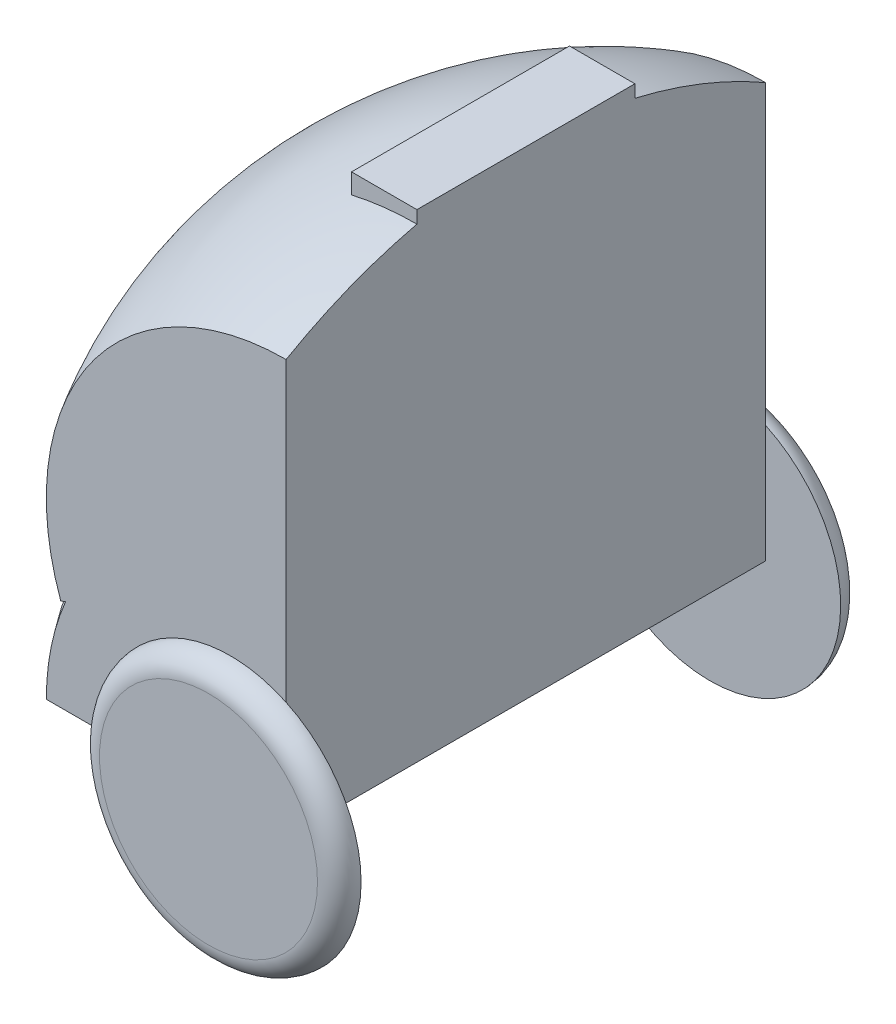
ISO-10303-21;
HEADER;
FILE_DESCRIPTION(('STEP AP214'),'2;1');
FILE_NAME('part.step','',(''),(''),'','','');
FILE_SCHEMA(('AUTOMOTIVE_DESIGN { 1 0 10303 214 1 1 1 1 }'));
ENDSEC;
DATA;
#1=APPLICATION_CONTEXT('core data for automotive mechanical design processes');
#2=APPLICATION_PROTOCOL_DEFINITION('international standard','automotive_design',2000,#1);
#3=PRODUCT_CONTEXT('',#1,'mechanical');
#4=PRODUCT('Part','Part','',(#3));
#5=PRODUCT_RELATED_PRODUCT_CATEGORY('part','',(#4));
#6=PRODUCT_DEFINITION_FORMATION('','',#4);
#7=PRODUCT_DEFINITION_CONTEXT('part definition',#1,'design');
#8=PRODUCT_DEFINITION('design','',#6,#7);
#9=PRODUCT_DEFINITION_SHAPE('','',#8);
#10=(LENGTH_UNIT() NAMED_UNIT(*) SI_UNIT(.MILLI.,.METRE.));
#11=(NAMED_UNIT(*) PLANE_ANGLE_UNIT() SI_UNIT($,.RADIAN.));
#12=(NAMED_UNIT(*) SI_UNIT($,.STERADIAN.) SOLID_ANGLE_UNIT());
#13=UNCERTAINTY_MEASURE_WITH_UNIT(LENGTH_MEASURE(1.E-05),#10,'distance_accuracy_value','');
#14=(GEOMETRIC_REPRESENTATION_CONTEXT(3) GLOBAL_UNCERTAINTY_ASSIGNED_CONTEXT((#13)) GLOBAL_UNIT_ASSIGNED_CONTEXT((#10,
#11,#12)) REPRESENTATION_CONTEXT('',''));
#15=CARTESIAN_POINT('',(0.,0.,0.));
#16=DIRECTION('',(0.,0.,1.));
#17=DIRECTION('',(1.,0.,0.));
#18=AXIS2_PLACEMENT_3D('',#15,#16,#17);
#19=CARTESIAN_POINT('',(-20.,0.,0.));
#20=DIRECTION('',(0.,0.,1.));
#21=DIRECTION('',(1.,0.,0.));
#22=AXIS2_PLACEMENT_3D('',#19,#20,#21);
#23=DEGENERATE_TOROIDAL_SURFACE('',#22,20.,93.0053761886914,.F.);
#24=CARTESIAN_POINT('',(-70.5858831778158,21.5882442492076,-55.0002));
#25=CARTESIAN_POINT('',(-71.9859669479254,21.0786554314085,-53.5169304533516));
#26=CARTESIAN_POINT('',(-73.3243789361277,20.5915133065178,-51.9683101868434));
#27=CARTESIAN_POINT('',(-75.8724012085119,19.6641090431226,-48.7545639388168));
#28=CARTESIAN_POINT('',(-77.0819754120248,19.2238600369076,-47.0894055363211));
#29=CARTESIAN_POINT('',(-79.348904355798,18.3987653781777,-43.6834225094398));
#30=CARTESIAN_POINT('',(-80.4082743165203,18.013186245399,-41.9441119666273));
#31=CARTESIAN_POINT('',(-82.3907924343558,17.2916086616134,-38.3807871618655));
#32=CARTESIAN_POINT('',(-83.3140239381899,16.955579874881,-36.5568256318827));
#33=CARTESIAN_POINT('',(-84.4113400530158,16.5561894715037,-34.1646883879962));
#34=CARTESIAN_POINT('',(-84.6498452047635,16.4693806955484,-33.629281085382));
#35=CARTESIAN_POINT('',(-85.1158210860264,16.2997793448828,-32.5516350266791));
#36=CARTESIAN_POINT('',(-85.3432665139075,16.2169959792141,-32.009383880414));
#37=CARTESIAN_POINT('',(-85.5648958667142,16.1363294917528,-31.4643944417996));
#38=B_SPLINE_CURVE_WITH_KNOTS('',3,(#24,#25,#26,#27,#28,#29,#30,#31,#32,#33,#34,#35,#36,#37),
.UNSPECIFIED.,.F.,.F.,(4,2,2,2,2,2,4),(0.,6.30456180395154,12.6108845666964,18.8223903207371,
25.0300773342398,26.8075422871663,28.5888987633277),.UNSPECIFIED.);
#39=CARTESIAN_POINT('',(-70.5860719669435,21.5881755355845,-55.));
#40=VERTEX_POINT('',#39);
#41=CARTESIAN_POINT('',(-73.2522754071277,20.6177568448593,-52.0089683465835));
#42=VERTEX_POINT('',#41);
#43=EDGE_CURVE('E207',#40,#42,#38,.T.);
#44=ORIENTED_EDGE('',*,*,#43,.F.);
#45=CARTESIAN_POINT('',(-20.,0.,-55.));
#46=DIRECTION('',(0.,0.,1.));
#47=DIRECTION('',(1.,0.,0.));
#48=AXIS2_PLACEMENT_3D('',#45,#46,#47);
#49=CIRCLE('',#48,55.);
#50=CARTESIAN_POINT('',(-75.,0.,-55.));
#51=VERTEX_POINT('',#50);
#52=EDGE_CURVE('E146',#40,#51,#49,.T.);
#53=ORIENTED_EDGE('',*,*,#52,.T.);
#54=CARTESIAN_POINT('',(0.,0.,0.));
#55=DIRECTION('',(0.,1.,0.));
#56=DIRECTION('',(0.,0.,1.));
#57=AXIS2_PLACEMENT_3D('',#54,#55,#56);
#58=CIRCLE('',#57,93.0053761886914);
#59=CARTESIAN_POINT('',(-75.,0.,55.));
#60=VERTEX_POINT('',#59);
#61=EDGE_CURVE('E286',#51,#60,#58,.T.);
#62=ORIENTED_EDGE('',*,*,#61,.T.);
#63=CARTESIAN_POINT('',(-20.,0.,55.));
#64=DIRECTION('',(0.,0.,1.));
#65=DIRECTION('',(1.,0.,0.));
#66=AXIS2_PLACEMENT_3D('',#63,#64,#65);
#67=CIRCLE('',#66,55.);
#68=CARTESIAN_POINT('',(-70.5860719669435,21.5881755355845,55.));
#69=VERTEX_POINT('',#68);
#70=EDGE_CURVE('E288',#69,#60,#67,.T.);
#71=ORIENTED_EDGE('',*,*,#70,.F.);
#72=CARTESIAN_POINT('',(-85.5648958667142,16.1363294917528,31.4643944417996));
#73=CARTESIAN_POINT('',(-85.1182419736263,16.2988982138559,32.5627269859426));
#74=CARTESIAN_POINT('',(-84.6479230618541,16.4700802983535,33.6500022293817));
#75=CARTESIAN_POINT('',(-83.6605599147931,16.8294510942951,35.8002908307443));
#76=CARTESIAN_POINT('',(-83.1435143222884,17.0176402997253,36.8633034828163));
#77=CARTESIAN_POINT('',(-81.5331062559626,17.6037809008901,39.9934461578371));
#78=CARTESIAN_POINT('',(-80.3722790336476,18.0262874569386,42.0218295238811));
#79=CARTESIAN_POINT('',(-77.8767200486395,18.9345966453372,45.9543177183319));
#80=CARTESIAN_POINT('',(-76.5419598349357,19.4204096330081,47.8584021379453));
#81=CARTESIAN_POINT('',(-74.4096929346977,20.1964913162059,50.6133966056721));
#82=CARTESIAN_POINT('',(-73.6736170348149,20.4644010339239,51.5187383688662));
#83=CARTESIAN_POINT('',(-72.1603409890285,21.0151884708182,53.2898303153666));
#84=CARTESIAN_POINT('',(-71.3831354734766,21.2980681443866,54.1555753015008));
#85=CARTESIAN_POINT('',(-70.5858831778158,21.5882442492076,55.0002));
#86=B_SPLINE_CURVE_WITH_KNOTS('',3,(#72,#73,#74,#75,#76,#77,#78,#79,#80,#81,#82,#83,#84,#85),
.UNSPECIFIED.,.F.,.F.,(4,2,2,2,2,2,4),(0.,3.58969941897906,7.17950313734413,14.2935043353267,
21.4086706670009,24.9989130657109,28.5896253479457),.UNSPECIFIED.);
#87=CARTESIAN_POINT('',(-73.2522754071276,20.6177568448593,52.0089683465836));
#88=VERTEX_POINT('',#87);
#89=EDGE_CURVE('E199',#88,#69,#86,.T.);
#90=ORIENTED_EDGE('',*,*,#89,.F.);
#91=CARTESIAN_POINT('',(-71.2346129573545,19.9999575437838,55.0002));
#92=CARTESIAN_POINT('',(-71.9688610285277,20.2212796989832,53.9577825618948));
#93=CARTESIAN_POINT('',(-72.6809406397668,20.4397704467221,52.8991670998298));
#94=CARTESIAN_POINT('',(-74.060053114577,20.8693274042112,50.7515528985336));
#95=CARTESIAN_POINT('',(-74.7270868871971,21.0803937637483,49.6625547730678));
#96=CARTESIAN_POINT('',(-76.0153536187748,21.4933255994882,47.4562723957654));
#97=CARTESIAN_POINT('',(-76.6365918259897,21.6951921289933,46.3389914049746));
#98=CARTESIAN_POINT('',(-77.8326958695606,22.0882278957065,44.0780335568028));
#99=CARTESIAN_POINT('',(-78.4075615174586,22.2793970894397,42.9343565921729));
#100=CARTESIAN_POINT('',(-79.5099070331423,22.6495362725192,40.6234561190515));
#101=CARTESIAN_POINT('',(-80.0374196401767,22.8285146694404,39.4562495730554));
#102=CARTESIAN_POINT('',(-81.0449691584019,23.1732207651699,37.0994715956909));
#103=CARTESIAN_POINT('',(-81.5250016657527,23.3389472345724,35.9098981019145));
#104=CARTESIAN_POINT('',(-82.4369530865813,23.6560443150717,33.5106815172943));
#105=CARTESIAN_POINT('',(-82.8688759717933,23.8074161110782,32.3010400926641));
#106=CARTESIAN_POINT('',(-83.6841927441509,24.0948914975889,29.8635970962876));
#107=CARTESIAN_POINT('',(-84.0675821181739,24.2309936680396,28.6357938475156));
#108=CARTESIAN_POINT('',(-84.7868620763784,24.4876412557893,26.1590238086939));
#109=CARTESIAN_POINT('',(-85.1225436779215,24.6081180366989,24.9099892111154));
#110=CARTESIAN_POINT('',(-85.7440891803539,24.8321352506472,22.3979596520562));
#111=CARTESIAN_POINT('',(-86.0299484665002,24.9356741147737,21.1349634089012));
#112=CARTESIAN_POINT('',(-86.5514430210002,25.12520113822,18.597448392701));
#113=CARTESIAN_POINT('',(-86.7870824421336,25.2111907486973,17.3229305814896));
#114=CARTESIAN_POINT('',(-87.2078967293744,25.3651543930577,14.7643966481112));
#115=CARTESIAN_POINT('',(-87.3930672263439,25.4331268671681,13.480379713474));
#116=CARTESIAN_POINT('',(-87.7126561269976,25.5506596607405,10.9054690615624));
#117=CARTESIAN_POINT('',(-87.8470847007801,25.6002236697411,9.61457677495558));
#118=CARTESIAN_POINT('',(-88.0650753842249,25.6806887457783,7.02792486181214));
#119=CARTESIAN_POINT('',(-88.1486374922056,25.711589812198,5.7321652351146));
#120=CARTESIAN_POINT('',(-88.2647931176471,25.7545628142702,3.13800768956397));
#121=CARTESIAN_POINT('',(-88.2973849078493,25.7666341118282,1.83960968279553));
#122=CARTESIAN_POINT('',(-88.311553252114,25.771880467467,-0.757390845087601));
#123=CARTESIAN_POINT('',(-88.2931341802576,25.7650571457244,-2.05599333911997));
#124=CARTESIAN_POINT('',(-88.2050149931057,25.732443993297,-4.66004382325121));
#125=CARTESIAN_POINT('',(-88.1349677741191,25.7065257853609,-5.96547847522404));
#126=CARTESIAN_POINT('',(-87.9432933183407,25.6357212265585,-8.57191819578897));
#127=CARTESIAN_POINT('',(-87.821670822857,25.590836619272,-9.87292366047624));
#128=CARTESIAN_POINT('',(-87.5269788189262,25.482338942635,-12.4684960255404));
#129=CARTESIAN_POINT('',(-87.3539020810989,25.4187232415563,-13.7630619951569));
#130=CARTESIAN_POINT('',(-86.9565433930753,25.2731269297976,-16.3431470714996));
#131=CARTESIAN_POINT('',(-86.7322662419803,25.1911480403438,-17.6286670144914));
#132=CARTESIAN_POINT('',(-86.2327682955909,25.0092825841188,-20.1885370565974));
#133=CARTESIAN_POINT('',(-85.9575459087543,24.9093954578928,-21.4628868054488));
#134=CARTESIAN_POINT('',(-85.3565305469213,24.6923023808316,-23.9979876600017));
#135=CARTESIAN_POINT('',(-85.0307421843537,24.5750980096541,-25.2587399947988));
#136=CARTESIAN_POINT('',(-84.3289996880626,24.3240652630733,-27.7644165809923));
#137=CARTESIAN_POINT('',(-83.9530502437914,24.1902384417481,-29.0093423000832));
#138=CARTESIAN_POINT('',(-83.1514571739509,23.9067846553467,-31.4811538600297));
#139=CARTESIAN_POINT('',(-82.7258157016414,23.7571583749211,-32.7080404799652));
#140=CARTESIAN_POINT('',(-81.5823222973909,23.3582623648794,-35.7983176480223));
#141=CARTESIAN_POINT('',(-80.8307028190923,23.0987825501439,-37.6480342426567));
#142=CARTESIAN_POINT('',(-79.2130348398649,22.5486737676701,-41.2914004611343));
#143=CARTESIAN_POINT('',(-78.3470064434152,22.2580502743376,-43.0850598672931));
#144=CARTESIAN_POINT('',(-76.5035645836438,21.6508124760878,-46.6073432708191));
#145=CARTESIAN_POINT('',(-75.5262728737879,21.334226685398,-48.3360356559074));
#146=CARTESIAN_POINT('',(-73.9782313355919,20.8440987052936,-50.8759826890194));
#147=CARTESIAN_POINT('',(-73.4484338898416,20.678150877879,-51.7139246746478));
#148=CARTESIAN_POINT('',(-72.3617637636838,20.3420207322976,-53.3712124820553));
#149=CARTESIAN_POINT('',(-71.8048907157153,20.1718383566606,-54.1905580511598));
#150=CARTESIAN_POINT('',(-71.2346129573545,19.9999575437838,-55.0002));
#151=B_SPLINE_CURVE_WITH_KNOTS('',3,(#91,#92,#93,#94,#95,#96,#97,#98,#99,#100,#101,#102,#103,
#104,#105,#106,#107,#108,#109,#110,#111,#112,#113,#114,#115,#116,#117,#118,#119,#120,#121,#122,
#123,#124,#125,#126,#127,#128,#129,#130,#131,#132,#133,#134,#135,#136,#137,#138,#139,#140,#141,
#142,#143,#144,#145,#146,#147,#148,#149,#150),.UNSPECIFIED.,.F.,.F.,(4,2,2,2,2,2,2,2,2,2,2,2,2,
2,2,2,2,2,2,2,2,2,2,2,2,2,2,2,2,4),(0.,3.88203560214758,7.76399283932448,11.6455045030897,
15.5270319405129,19.4058547336334,23.28503695583,27.16389869082,31.0431208559406,
34.9388440685908,38.8349279272204,42.7306894858609,46.6267881968508,50.522105605698,
54.4174231433145,58.3128726807871,62.2079882014594,66.1295328255952,70.0507170208113,
73.972452407514,77.8938203541589,81.8153108260352,85.73644380502,89.6572104621824,
93.5778072873156,99.6133943666538,105.647922251215,111.675909004775,114.690954667139,
117.706041271264),.UNSPECIFIED.);
#152=EDGE_CURVE('E234',#88,#42,#151,.T.);
#153=ORIENTED_EDGE('',*,*,#152,.T.);
#154=EDGE_LOOP('',(#44,#53,#62,#71,#90,#153));
#155=FACE_BOUND('',#154,.T.);
#156=ADVANCED_FACE('F45',(#155),#23,.F.);
#157=CARTESIAN_POINT('',(-20.,0.,55.));
#158=DIRECTION('',(0.,0.,-1.));
#159=DIRECTION('',(-1.,0.,0.));
#160=AXIS2_PLACEMENT_3D('',#157,#158,#159);
#161=PLANE('',#160);
#162=CARTESIAN_POINT('',(-32.8028578243117,-0.227507999499375,55.));
#163=DIRECTION('',(0.,0.,1.));
#164=DIRECTION('',(1.,0.,0.));
#165=AXIS2_PLACEMENT_3D('',#162,#163,#164);
#166=CIRCLE('',#165,30.);
#167=CARTESIAN_POINT('',(-19.9999999999999,26.9034122121421,55.));
#168=VERTEX_POINT('',#167);
#169=CARTESIAN_POINT('',(-62.8019951470775,0.,55.));
#170=VERTEX_POINT('',#169);
#171=EDGE_CURVE('E159',#168,#170,#166,.T.);
#172=ORIENTED_EDGE('',*,*,#171,.F.);
#173=DIRECTION('',(0.,-1.,0.));
#174=VECTOR('',#173,1.);
#175=CARTESIAN_POINT('',(-20.,0.,55.));
#176=LINE('',#175,#174);
#177=CARTESIAN_POINT('',(-19.9999999999997,95.,55.));
#178=VERTEX_POINT('',#177);
#179=EDGE_CURVE('E292',#178,#168,#176,.T.);
#180=ORIENTED_EDGE('',*,*,#179,.F.);
#181=CARTESIAN_POINT('',(-19.9999999999998,40.,55.));
#182=DIRECTION('',(0.,0.,-1.));
#183=DIRECTION('',(-1.,0.,0.));
#184=AXIS2_PLACEMENT_3D('',#181,#182,#183);
#185=CIRCLE('',#184,55.);
#186=CARTESIAN_POINT('',(-71.6830941432248,21.1888921170882,55.));
#187=VERTEX_POINT('',#186);
#188=EDGE_CURVE('E196',#187,#178,#185,.T.);
#189=ORIENTED_EDGE('',*,*,#188,.F.);
#190=DIRECTION('',(0.939692620785908,0.342020143325669,0.));
#191=VECTOR('',#190,1.);
#192=CARTESIAN_POINT('',(-34.0953893117885,34.869697850115,55.));
#193=LINE('',#192,#191);
#194=EDGE_CURVE('E186',#187,#69,#193,.T.);
#195=ORIENTED_EDGE('',*,*,#194,.T.);
#196=ORIENTED_EDGE('',*,*,#70,.T.);
#197=DIRECTION('',(1.,0.,0.));
#198=VECTOR('',#197,1.);
#199=CARTESIAN_POINT('',(-20.,0.,55.));
#200=LINE('',#199,#198);
#201=EDGE_CURVE('E297',#60,#170,#200,.T.);
#202=ORIENTED_EDGE('',*,*,#201,.T.);
#203=EDGE_LOOP('',(#172,#180,#189,#195,#196,#202));
#204=FACE_BOUND('',#203,.T.);
#205=ADVANCED_FACE('F271',(#204),#161,.F.);
#206=CARTESIAN_POINT('',(-20.,0.,-55.));
#207=DIRECTION('',(0.,0.,1.));
#208=DIRECTION('',(1.,0.,0.));
#209=AXIS2_PLACEMENT_3D('',#206,#207,#208);
#210=PLANE('',#209);
#211=CARTESIAN_POINT('',(-32.8028578243117,-0.227507999499375,-55.));
#212=DIRECTION('',(0.,0.,-1.));
#213=DIRECTION('',(-1.,0.,0.));
#214=AXIS2_PLACEMENT_3D('',#211,#212,#213);
#215=CIRCLE('',#214,30.);
#216=CARTESIAN_POINT('',(-62.8019951470776,0.,-55.));
#217=VERTEX_POINT('',#216);
#218=CARTESIAN_POINT('',(-19.9999999999999,26.9034122121421,-55.));
#219=VERTEX_POINT('',#218);
#220=EDGE_CURVE('E150',#217,#219,#215,.T.);
#221=ORIENTED_EDGE('',*,*,#220,.F.);
#222=DIRECTION('',(-1.,0.,0.));
#223=VECTOR('',#222,1.);
#224=CARTESIAN_POINT('',(-20.,0.,-55.));
#225=LINE('',#224,#223);
#226=EDGE_CURVE('E287',#217,#51,#225,.T.);
#227=ORIENTED_EDGE('',*,*,#226,.T.);
#228=ORIENTED_EDGE('',*,*,#52,.F.);
#229=DIRECTION('',(-0.939692620785908,-0.342020143325669,0.));
#230=VECTOR('',#229,1.);
#231=CARTESIAN_POINT('',(-34.0953893117885,34.869697850115,-55.));
#232=LINE('',#231,#230);
#233=CARTESIAN_POINT('',(-71.6830941432248,21.1888921170882,-55.));
#234=VERTEX_POINT('',#233);
#235=EDGE_CURVE('E189',#40,#234,#232,.T.);
#236=ORIENTED_EDGE('',*,*,#235,.T.);
#237=CARTESIAN_POINT('',(-19.9999999999999,40.,-55.));
#238=DIRECTION('',(0.,0.,-1.));
#239=DIRECTION('',(-1.,0.,0.));
#240=AXIS2_PLACEMENT_3D('',#237,#238,#239);
#241=CIRCLE('',#240,55.);
#242=CARTESIAN_POINT('',(-19.9999999999997,95.,-55.));
#243=VERTEX_POINT('',#242);
#244=EDGE_CURVE('E153',#234,#243,#241,.T.);
#245=ORIENTED_EDGE('',*,*,#244,.T.);
#246=DIRECTION('',(0.,1.,0.));
#247=VECTOR('',#246,1.);
#248=CARTESIAN_POINT('',(-20.,0.,-55.));
#249=LINE('',#248,#247);
#250=EDGE_CURVE('E140',#219,#243,#249,.T.);
#251=ORIENTED_EDGE('',*,*,#250,.F.);
#252=EDGE_LOOP('',(#221,#227,#228,#236,#245,#251));
#253=FACE_BOUND('',#252,.T.);
#254=ADVANCED_FACE('F149',(#253),#210,.F.);
#255=CARTESIAN_POINT('',(-20.0000000000001,-20.,0.));
#256=DIRECTION('',(1.,0.,0.));
#257=DIRECTION('',(0.,0.,1.));
#258=AXIS2_PLACEMENT_3D('',#255,#256,#257);
#259=PLANE('',#258);
#260=CARTESIAN_POINT('',(-20.,0.,0.));
#261=DIRECTION('',(1.,0.,0.));
#262=DIRECTION('',(0.,1.,0.));
#263=AXIS2_PLACEMENT_3D('',#260,#261,#262);
#264=CIRCLE('',#263,109.772492000501);
#265=CARTESIAN_POINT('',(-19.9999999999996,106.88779163216,-25.));
#266=VERTEX_POINT('',#265);
#267=EDGE_CURVE('E184',#243,#266,#264,.T.);
#268=ORIENTED_EDGE('',*,*,#267,.T.);
#269=DIRECTION('',(0.,1.,0.));
#270=VECTOR('',#269,1.);
#271=CARTESIAN_POINT('',(-19.9999999999996,99.7724920005008,-25.));
#272=LINE('',#271,#270);
#273=CARTESIAN_POINT('',(-19.9999999999996,109.772492000501,-25.));
#274=VERTEX_POINT('',#273);
#275=EDGE_CURVE('E166',#266,#274,#272,.T.);
#276=ORIENTED_EDGE('',*,*,#275,.T.);
#277=DIRECTION('',(0.,0.,1.));
#278=VECTOR('',#277,1.);
#279=CARTESIAN_POINT('',(-19.9999999999996,109.772492000501,0.));
#280=LINE('',#279,#278);
#281=CARTESIAN_POINT('',(-19.9999999999996,109.772492000501,25.));
#282=VERTEX_POINT('',#281);
#283=EDGE_CURVE('E162',#274,#282,#280,.T.);
#284=ORIENTED_EDGE('',*,*,#283,.T.);
#285=DIRECTION('',(0.,-1.,0.));
#286=VECTOR('',#285,1.);
#287=CARTESIAN_POINT('',(-19.9999999999996,109.772492000501,25.));
#288=LINE('',#287,#286);
#289=CARTESIAN_POINT('',(-19.9999999999996,106.88779163216,25.));
#290=VERTEX_POINT('',#289);
#291=EDGE_CURVE('E173',#282,#290,#288,.T.);
#292=ORIENTED_EDGE('',*,*,#291,.T.);
#293=EDGE_CURVE('E181',#290,#178,#264,.T.);
#294=ORIENTED_EDGE('',*,*,#293,.T.);
#295=ORIENTED_EDGE('',*,*,#179,.T.);
#296=CARTESIAN_POINT('',(-20.,0.,55.));
#297=VERTEX_POINT('',#296);
#298=EDGE_CURVE('E295',#168,#297,#176,.T.);
#299=ORIENTED_EDGE('',*,*,#298,.T.);
#300=DIRECTION('',(0.,0.,-1.));
#301=VECTOR('',#300,1.);
#302=CARTESIAN_POINT('',(-20.,0.,55.));
#303=LINE('',#302,#301);
#304=CARTESIAN_POINT('',(-20.,0.,-55.));
#305=VERTEX_POINT('',#304);
#306=EDGE_CURVE('E143',#297,#305,#303,.T.);
#307=ORIENTED_EDGE('',*,*,#306,.T.);
#308=EDGE_CURVE('E136',#305,#219,#249,.T.);
#309=ORIENTED_EDGE('',*,*,#308,.T.);
#310=ORIENTED_EDGE('',*,*,#250,.T.);
#311=EDGE_LOOP('',(#268,#276,#284,#292,#294,#295,#299,#307,#309,#310));
#312=FACE_BOUND('',#311,.T.);
#313=ADVANCED_FACE('F139',(#312),#259,.T.);
#314=CARTESIAN_POINT('',(0.,0.,0.));
#315=DIRECTION('',(0.,1.,0.));
#316=DIRECTION('',(0.,0.,1.));
#317=AXIS2_PLACEMENT_3D('',#314,#315,#316);
#318=PLANE('',#317);
#319=ORIENTED_EDGE('',*,*,#61,.F.);
#320=ORIENTED_EDGE('',*,*,#226,.F.);
#321=EDGE_CURVE('E156',#305,#217,#225,.T.);
#322=ORIENTED_EDGE('',*,*,#321,.F.);
#323=ORIENTED_EDGE('',*,*,#306,.F.);
#324=EDGE_CURVE('E298',#170,#297,#200,.T.);
#325=ORIENTED_EDGE('',*,*,#324,.F.);
#326=ORIENTED_EDGE('',*,*,#201,.F.);
#327=EDGE_LOOP('',(#319,#320,#322,#323,#325,#326));
#328=FACE_BOUND('',#327,.T.);
#329=ADVANCED_FACE('F230',(#328),#318,.F.);
#330=CARTESIAN_POINT('',(-19.9999999999999,40.,0.));
#331=DIRECTION('',(0.,0.,-1.));
#332=DIRECTION('',(-1.,0.,0.));
#333=AXIS2_PLACEMENT_3D('',#330,#331,#332);
#334=DEGENERATE_TOROIDAL_SURFACE('',#333,40.,109.772492000501,.F.);
#335=CARTESIAN_POINT('',(-19.9999999999999,40.,-25.));
#336=DIRECTION('',(0.,0.,-1.));
#337=DIRECTION('',(-1.,0.,0.));
#338=AXIS2_PLACEMENT_3D('',#335,#336,#337);
#339=CIRCLE('',#338,66.8877916321598);
#340=CARTESIAN_POINT('',(-34.9999999999996,105.184174992303,-25.));
#341=VERTEX_POINT('',#340);
#342=EDGE_CURVE('E315',#266,#341,#339,.F.);
#343=ORIENTED_EDGE('',*,*,#342,.F.);
#344=ORIENTED_EDGE('',*,*,#267,.F.);
#345=ORIENTED_EDGE('',*,*,#244,.F.);
#346=CARTESIAN_POINT('',(17.5877048314364,53.6808057330268,0.));
#347=DIRECTION('',(-0.342020143325669,0.939692620785908,0.));
#348=DIRECTION('',(-0.939692620785908,-0.342020143325669,0.));
#349=AXIS2_PLACEMENT_3D('',#346,#347,#348);
#350=CIRCLE('',#349,109.772492000501);
#351=EDGE_CURVE('E192',#234,#42,#350,.T.);
#352=ORIENTED_EDGE('',*,*,#351,.T.);
#353=ORIENTED_EDGE('',*,*,#152,.F.);
#354=EDGE_CURVE('E191',#88,#187,#350,.T.);
#355=ORIENTED_EDGE('',*,*,#354,.T.);
#356=ORIENTED_EDGE('',*,*,#188,.T.);
#357=ORIENTED_EDGE('',*,*,#293,.F.);
#358=CARTESIAN_POINT('',(-19.9999999999999,40.,25.));
#359=DIRECTION('',(0.,0.,1.));
#360=DIRECTION('',(1.,0.,0.));
#361=AXIS2_PLACEMENT_3D('',#358,#359,#360);
#362=CIRCLE('',#361,66.8877916321598);
#363=CARTESIAN_POINT('',(-34.9999999999996,105.184174992303,25.));
#364=VERTEX_POINT('',#363);
#365=EDGE_CURVE('E249',#364,#290,#362,.F.);
#366=ORIENTED_EDGE('',*,*,#365,.F.);
#367=CARTESIAN_POINT('',(-34.9999999999997,76.2358364318005,75.9903951359279));
#368=CARTESIAN_POINT('',(-34.9999999999997,77.27038316303,74.9938463883455));
#369=CARTESIAN_POINT('',(-34.9999999999997,78.2830281883605,73.9746505433971));
#370=CARTESIAN_POINT('',(-34.9999999999997,80.2631243306284,71.8939641587211));
#371=CARTESIAN_POINT('',(-34.9999999999997,81.2305918304611,70.8324892136668));
#372=CARTESIAN_POINT('',(-34.9999999999997,83.1194121005496,68.6698416547452));
#373=CARTESIAN_POINT('',(-34.9999999999997,84.0407788447069,67.5686812464425));
#374=CARTESIAN_POINT('',(-34.9999999999997,85.8368518214239,65.3284663235355));
#375=CARTESIAN_POINT('',(-34.9999999999997,86.711542740844,64.1893995694167));
#376=CARTESIAN_POINT('',(-34.9999999999997,89.2608838347355,60.7228490880051));
#377=CARTESIAN_POINT('',(-34.9999999999997,90.8640839451015,58.3422502516847));
#378=CARTESIAN_POINT('',(-34.9999999999997,93.8703433404504,53.4579680946523));
#379=CARTESIAN_POINT('',(-34.9999999999997,95.2734024319779,50.9542846549704));
#380=CARTESIAN_POINT('',(-34.9999999999997,97.2280266799776,47.1080924155434));
#381=CARTESIAN_POINT('',(-34.9999999999997,97.8572010867581,45.8045017148503));
#382=CARTESIAN_POINT('',(-34.9999999999997,99.0616130956352,43.1729339097493));
#383=CARTESIAN_POINT('',(-34.9999999999996,99.6368638745984,41.8449628583121));
#384=CARTESIAN_POINT('',(-34.9999999999996,100.732746358208,39.1665968840316));
#385=CARTESIAN_POINT('',(-34.9999999999996,101.253374499219,37.8162005047868));
#386=CARTESIAN_POINT('',(-34.9999999999996,102.239250611652,35.0952374394202));
#387=CARTESIAN_POINT('',(-34.9999999999996,102.704494995138,33.7246694529736));
#388=CARTESIAN_POINT('',(-34.9999999999996,103.578929186634,30.9655741146529));
#389=CARTESIAN_POINT('',(-34.9999999999996,103.988111719945,29.577044457572));
#390=CARTESIAN_POINT('',(-34.9999999999996,104.749775976776,26.7843927452315));
#391=CARTESIAN_POINT('',(-34.9999999999996,105.10225283858,25.3802693640497));
#392=CARTESIAN_POINT('',(-34.9999999999996,105.74991636178,22.5589634812247));
#393=CARTESIAN_POINT('',(-34.9999999999996,106.0451065924,21.1417817989412));
#394=CARTESIAN_POINT('',(-34.9999999999996,106.577806060735,18.2964864190968));
#395=CARTESIAN_POINT('',(-34.9999999999996,106.815309941726,16.8683717189934));
#396=CARTESIAN_POINT('',(-34.9999999999996,107.239621259508,13.9530023007049));
#397=CARTESIAN_POINT('',(-34.9999999999996,107.424337772378,12.4654428367834));
#398=CARTESIAN_POINT('',(-34.9999999999996,107.731230307412,9.48374607788922));
#399=CARTESIAN_POINT('',(-34.9999999999996,107.85340032428,7.9896081651838));
#400=CARTESIAN_POINT('',(-34.9999999999996,108.03496998084,4.99762682288441));
#401=CARTESIAN_POINT('',(-34.9999999999996,108.094373991512,3.49978365860413));
#402=CARTESIAN_POINT('',(-34.9999999999996,108.15033312688,0.502785386035715));
#403=CARTESIAN_POINT('',(-34.9999999999996,108.146882413528,-0.9963698311865));
#404=CARTESIAN_POINT('',(-34.9999999999996,108.077118521576,-3.99340139317728));
#405=CARTESIAN_POINT('',(-34.9999999999996,108.010797698139,-5.49127756024637));
#406=CARTESIAN_POINT('',(-34.9999999999996,107.815383483416,-8.48306155827067));
#407=CARTESIAN_POINT('',(-34.9999999999996,107.686284289549,-9.9769690095628));
#408=CARTESIAN_POINT('',(-34.9999999999996,107.365526421245,-12.9579245374068));
#409=CARTESIAN_POINT('',(-34.9999999999996,107.173874208744,-14.4449733063987));
#410=CARTESIAN_POINT('',(-34.9999999999996,106.728331966732,-17.4097557086097));
#411=CARTESIAN_POINT('',(-34.9999999999996,106.474436127398,-18.8874884590569));
#412=CARTESIAN_POINT('',(-34.9999999999996,105.616922063288,-23.3182394732626));
#413=CARTESIAN_POINT('',(-34.9999999999996,104.919108699961,-26.253626594402));
#414=CARTESIAN_POINT('',(-34.9999999999996,103.277898360969,-32.0546599269334));
#415=CARTESIAN_POINT('',(-34.9999999999996,102.334490685257,-34.9203030937725));
#416=CARTESIAN_POINT('',(-34.9999999999996,100.208688283556,-40.5599040913601));
#417=CARTESIAN_POINT('',(-34.9999999999996,99.0264186951214,-43.3339090487823));
#418=CARTESIAN_POINT('',(-34.9999999999997,96.4301184681387,-48.7710076664222));
#419=CARTESIAN_POINT('',(-34.9999999999997,95.0161222536398,-51.4341177270021));
#420=CARTESIAN_POINT('',(-34.9999999999997,92.30835649826,-56.0449780648455));
#421=CARTESIAN_POINT('',(-34.9999999999997,91.0589959823745,-58.0189798946559));
#422=CARTESIAN_POINT('',(-34.9999999999997,88.430846294594,-61.8786728044212));
#423=CARTESIAN_POINT('',(-34.9999999999997,87.0520853802011,-63.7643830306539));
#424=CARTESIAN_POINT('',(-34.9999999999997,84.8908239480955,-66.5189503276764));
#425=CARTESIAN_POINT('',(-34.9999999999997,84.1549346362753,-67.4247495947483));
#426=CARTESIAN_POINT('',(-34.9999999999997,82.6525437395492,-69.2106478749716));
#427=CARTESIAN_POINT('',(-34.9999999999997,81.8860425776609,-70.0907472429728));
#428=CARTESIAN_POINT('',(-34.9999999999997,80.3227683021651,-71.8241839243272));
#429=CARTESIAN_POINT('',(-34.9999999999997,79.5259848003488,-72.6775118672398));
#430=CARTESIAN_POINT('',(-34.9999999999997,77.9029039359092,-74.3556851277771));
#431=CARTESIAN_POINT('',(-34.9999999999997,77.0766053517328,-75.1805292637454));
#432=CARTESIAN_POINT('',(-34.9999999999997,76.2358364318005,-75.9903951359278));
#433=B_SPLINE_CURVE_WITH_KNOTS('',3,(#367,#368,#369,#370,#371,#372,#373,#374,#375,#376,#377,
#378,#379,#380,#381,#382,#383,#384,#385,#386,#387,#388,#389,#390,#391,#392,#393,#394,#395,#396,
#397,#398,#399,#400,#401,#402,#403,#404,#405,#406,#407,#408,#409,#410,#411,#412,#413,#414,#415,
#416,#417,#418,#419,#420,#421,#422,#423,#424,#425,#426,#427,#428,#429,#430,#431,#432),
.UNSPECIFIED.,.F.,.F.,(4,2,2,2,2,2,2,2,2,2,2,2,2,2,2,2,2,2,2,2,2,2,2,2,2,2,2,2,2,2,2,2,4),(0.,
4.30891632561512,8.61625776156432,12.9222855617245,17.2297174817042,25.8296453272818,
34.4295814854522,38.7710189676134,43.1113927882318,47.4520496032202,51.7929874668369,
56.1344880869368,60.4763607316787,64.8179627705348,69.1599678142371,73.6555923255978,
78.1516483957407,82.6473913429257,87.1435518640782,91.6402591764501,96.1373821967556,
100.634040796089,105.131119273623,114.170944918123,123.211164475466,132.246660169079,
141.280814813229,148.284448583554,155.286556494987,158.787152564705,162.287700277269,
165.789459870947,169.291364561727),.UNSPECIFIED.);
#434=EDGE_CURVE('E241',#364,#341,#433,.T.);
#435=ORIENTED_EDGE('',*,*,#434,.T.);
#436=EDGE_LOOP('',(#343,#344,#345,#352,#353,#355,#356,#357,#366,#435));
#437=FACE_BOUND('',#436,.T.);
#438=ADVANCED_FACE('F222',(#437),#334,.F.);
#439=CARTESIAN_POINT('',(17.5877048314364,53.6808057330268,0.));
#440=DIRECTION('',(-0.342020143325669,0.939692620785908,0.));
#441=DIRECTION('',(-0.939692620785908,-0.342020143325669,0.));
#442=AXIS2_PLACEMENT_3D('',#439,#440,#441);
#443=PLANE('',#442);
#444=ORIENTED_EDGE('',*,*,#235,.F.);
#445=ORIENTED_EDGE('',*,*,#43,.T.);
#446=ORIENTED_EDGE('',*,*,#351,.F.);
#447=EDGE_LOOP('',(#444,#445,#446));
#448=FACE_BOUND('',#447,.T.);
#449=ADVANCED_FACE('F216',(#448),#443,.F.);
#450=ORIENTED_EDGE('',*,*,#354,.F.);
#451=ORIENTED_EDGE('',*,*,#89,.T.);
#452=ORIENTED_EDGE('',*,*,#194,.F.);
#453=EDGE_LOOP('',(#450,#451,#452));
#454=FACE_BOUND('',#453,.T.);
#455=ADVANCED_FACE('F221',(#454),#443,.F.);
#456=CARTESIAN_POINT('',(-34.9999999999997,99.7724920005008,-25.));
#457=DIRECTION('',(0.,0.,-1.));
#458=DIRECTION('',(-1.,0.,0.));
#459=AXIS2_PLACEMENT_3D('',#456,#457,#458);
#460=PLANE('',#459);
#461=ORIENTED_EDGE('',*,*,#275,.F.);
#462=ORIENTED_EDGE('',*,*,#342,.T.);
#463=DIRECTION('',(0.,1.,0.));
#464=VECTOR('',#463,1.);
#465=CARTESIAN_POINT('',(-34.9999999999997,99.7724920005008,-25.));
#466=LINE('',#465,#464);
#467=CARTESIAN_POINT('',(-34.9999999999996,109.772492000501,-25.));
#468=VERTEX_POINT('',#467);
#469=EDGE_CURVE('E169',#341,#468,#466,.T.);
#470=ORIENTED_EDGE('',*,*,#469,.T.);
#471=DIRECTION('',(1.,0.,0.));
#472=VECTOR('',#471,1.);
#473=CARTESIAN_POINT('',(-34.9999999999996,109.772492000501,-25.));
#474=LINE('',#473,#472);
#475=EDGE_CURVE('E178',#468,#274,#474,.T.);
#476=ORIENTED_EDGE('',*,*,#475,.T.);
#477=EDGE_LOOP('',(#461,#462,#470,#476));
#478=FACE_BOUND('',#477,.T.);
#479=ADVANCED_FACE('F260',(#478),#460,.T.);
#480=CARTESIAN_POINT('',(-34.9999999999996,109.772492000501,25.));
#481=DIRECTION('',(0.,0.,1.));
#482=DIRECTION('',(1.,0.,0.));
#483=AXIS2_PLACEMENT_3D('',#480,#481,#482);
#484=PLANE('',#483);
#485=DIRECTION('',(0.,-1.,0.));
#486=VECTOR('',#485,1.);
#487=CARTESIAN_POINT('',(-34.9999999999996,109.772492000501,25.));
#488=LINE('',#487,#486);
#489=CARTESIAN_POINT('',(-34.9999999999996,109.772492000501,25.));
#490=VERTEX_POINT('',#489);
#491=EDGE_CURVE('E165',#490,#364,#488,.T.);
#492=ORIENTED_EDGE('',*,*,#491,.T.);
#493=ORIENTED_EDGE('',*,*,#365,.T.);
#494=ORIENTED_EDGE('',*,*,#291,.F.);
#495=DIRECTION('',(1.,0.,0.));
#496=VECTOR('',#495,1.);
#497=CARTESIAN_POINT('',(-34.9999999999996,109.772492000501,25.));
#498=LINE('',#497,#496);
#499=EDGE_CURVE('E171',#490,#282,#498,.T.);
#500=ORIENTED_EDGE('',*,*,#499,.F.);
#501=EDGE_LOOP('',(#492,#493,#494,#500));
#502=FACE_BOUND('',#501,.T.);
#503=ADVANCED_FACE('F262',(#502),#484,.T.);
#504=CARTESIAN_POINT('',(-34.9999999999996,109.772492000501,0.));
#505=DIRECTION('',(0.,1.,0.));
#506=DIRECTION('',(-1.,0.,0.));
#507=AXIS2_PLACEMENT_3D('',#504,#505,#506);
#508=PLANE('',#507);
#509=ORIENTED_EDGE('',*,*,#283,.F.);
#510=ORIENTED_EDGE('',*,*,#475,.F.);
#511=DIRECTION('',(0.,0.,1.));
#512=VECTOR('',#511,1.);
#513=CARTESIAN_POINT('',(-34.9999999999996,109.772492000501,-25.));
#514=LINE('',#513,#512);
#515=EDGE_CURVE('E163',#468,#490,#514,.T.);
#516=ORIENTED_EDGE('',*,*,#515,.T.);
#517=ORIENTED_EDGE('',*,*,#499,.T.);
#518=EDGE_LOOP('',(#509,#510,#516,#517));
#519=FACE_BOUND('',#518,.T.);
#520=ADVANCED_FACE('F224',(#519),#508,.T.);
#521=CARTESIAN_POINT('',(-35.,1.21761159121719E-13,0.));
#522=DIRECTION('',(1.,0.,0.));
#523=DIRECTION('',(0.,1.,0.));
#524=AXIS2_PLACEMENT_3D('',#521,#522,#523);
#525=PLANE('',#524);
#526=ORIENTED_EDGE('',*,*,#434,.F.);
#527=ORIENTED_EDGE('',*,*,#491,.F.);
#528=ORIENTED_EDGE('',*,*,#515,.F.);
#529=ORIENTED_EDGE('',*,*,#469,.F.);
#530=EDGE_LOOP('',(#526,#527,#528,#529));
#531=FACE_BOUND('',#530,.T.);
#532=ADVANCED_FACE('F251',(#531),#525,.F.);
#533=CARTESIAN_POINT('',(-32.8028578243117,-0.227507999499375,60.));
#534=DIRECTION('',(0.,0.,1.));
#535=DIRECTION('',(1.,0.,0.));
#536=AXIS2_PLACEMENT_3D('',#533,#534,#535);
#537=PLANE('',#536);
#538=CARTESIAN_POINT('',(-32.8028578243117,-0.227507999499375,60.));
#539=DIRECTION('',(0.,0.,1.));
#540=DIRECTION('',(1.,0.,0.));
#541=AXIS2_PLACEMENT_3D('',#538,#539,#540);
#542=CIRCLE('',#541,25.);
#543=CARTESIAN_POINT('',(-7.80285782431169,-0.227507999499375,60.));
#544=VERTEX_POINT('',#543);
#545=EDGE_CURVE('E53',#544,#544,#542,.T.);
#546=ORIENTED_EDGE('',*,*,#545,.T.);
#547=EDGE_LOOP('',(#546));
#548=FACE_BOUND('',#547,.T.);
#549=ADVANCED_FACE('F256',(#548),#537,.T.);
#550=CARTESIAN_POINT('',(-32.8028578243117,-0.227507999499375,55.));
#551=DIRECTION('',(0.,0.,1.));
#552=DIRECTION('',(1.,0.,0.));
#553=AXIS2_PLACEMENT_3D('',#550,#551,#552);
#554=PLANE('',#553);
#555=ORIENTED_EDGE('',*,*,#298,.F.);
#556=EDGE_CURVE('E66',#170,#168,#166,.T.);
#557=ORIENTED_EDGE('',*,*,#556,.F.);
#558=ORIENTED_EDGE('',*,*,#324,.T.);
#559=EDGE_LOOP('',(#555,#557,#558));
#560=FACE_BOUND('',#559,.T.);
#561=ADVANCED_FACE('F258',(#560),#554,.F.);
#562=CARTESIAN_POINT('',(-32.8028578243117,-0.227507999499375,55.));
#563=DIRECTION('',(0.,0.,1.));
#564=DIRECTION('',(1.,0.,0.));
#565=AXIS2_PLACEMENT_3D('',#562,#563,#564);
#566=TOROIDAL_SURFACE('',#565,25.,5.);
#567=ORIENTED_EDGE('',*,*,#556,.T.);
#568=ORIENTED_EDGE('',*,*,#171,.T.);
#569=EDGE_LOOP('',(#567,#568));
#570=FACE_BOUND('',#569,.T.);
#571=ORIENTED_EDGE('',*,*,#545,.F.);
#572=EDGE_LOOP('',(#571));
#573=FACE_BOUND('',#572,.T.);
#574=ADVANCED_FACE('F321',(#570,#573),#566,.T.);
#575=CARTESIAN_POINT('',(-32.8028578243117,-0.227507999499375,-60.));
#576=DIRECTION('',(0.,0.,-1.));
#577=DIRECTION('',(-1.,0.,0.));
#578=AXIS2_PLACEMENT_3D('',#575,#576,#577);
#579=PLANE('',#578);
#580=CARTESIAN_POINT('',(-32.8028578243117,-0.227507999499375,-60.));
#581=DIRECTION('',(0.,0.,-1.));
#582=DIRECTION('',(-1.,0.,0.));
#583=AXIS2_PLACEMENT_3D('',#580,#581,#582);
#584=CIRCLE('',#583,25.);
#585=CARTESIAN_POINT('',(-57.8028578243117,-0.227507999499375,-60.));
#586=VERTEX_POINT('',#585);
#587=EDGE_CURVE('E13',#586,#586,#584,.T.);
#588=ORIENTED_EDGE('',*,*,#587,.T.);
#589=EDGE_LOOP('',(#588));
#590=FACE_BOUND('',#589,.T.);
#591=ADVANCED_FACE('F323',(#590),#579,.T.);
#592=CARTESIAN_POINT('',(-32.8028578243117,-0.227507999499375,-55.));
#593=DIRECTION('',(0.,0.,-1.));
#594=DIRECTION('',(-1.,0.,0.));
#595=AXIS2_PLACEMENT_3D('',#592,#593,#594);
#596=PLANE('',#595);
#597=ORIENTED_EDGE('',*,*,#308,.F.);
#598=ORIENTED_EDGE('',*,*,#321,.T.);
#599=EDGE_CURVE('E59',#219,#217,#215,.T.);
#600=ORIENTED_EDGE('',*,*,#599,.F.);
#601=EDGE_LOOP('',(#597,#598,#600));
#602=FACE_BOUND('',#601,.T.);
#603=ADVANCED_FACE('F155',(#602),#596,.F.);
#604=CARTESIAN_POINT('',(-32.8028578243117,-0.227507999499375,-55.));
#605=DIRECTION('',(0.,0.,-1.));
#606=DIRECTION('',(-1.,0.,0.));
#607=AXIS2_PLACEMENT_3D('',#604,#605,#606);
#608=TOROIDAL_SURFACE('',#607,25.,5.);
#609=ORIENTED_EDGE('',*,*,#599,.T.);
#610=ORIENTED_EDGE('',*,*,#220,.T.);
#611=EDGE_LOOP('',(#609,#610));
#612=FACE_BOUND('',#611,.T.);
#613=ORIENTED_EDGE('',*,*,#587,.F.);
#614=EDGE_LOOP('',(#613));
#615=FACE_BOUND('',#614,.T.);
#616=ADVANCED_FACE('F47',(#612,#615),#608,.T.);
#617=CLOSED_SHELL('',(#156,#205,#254,#313,#329,#438,#449,#455,#479,#503,#520,#532,#549,#561,
#574,#591,#603,#616));
#618=MANIFOLD_SOLID_BREP('B2',#617);
#619=ADVANCED_BREP_SHAPE_REPRESENTATION('',(#18,#618),#14);
#620=SHAPE_DEFINITION_REPRESENTATION(#9,#619);
ENDSEC;
END-ISO-10303-21;
